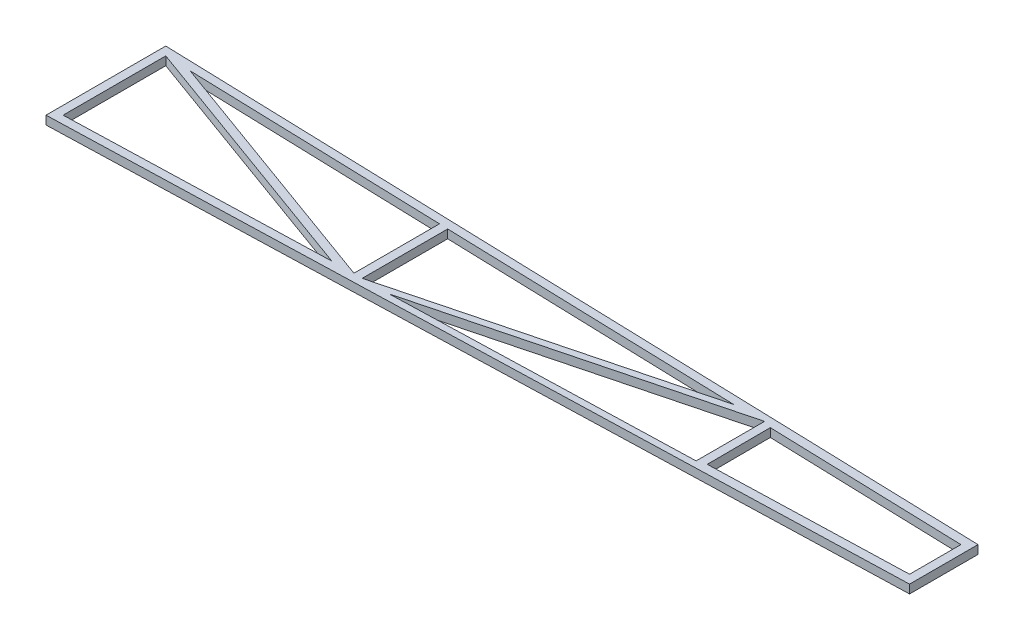
ISO-10303-21;
HEADER;
FILE_DESCRIPTION(('STEP AP214'),'2;1');
FILE_NAME('part.step','',(''),(''),'','','');
FILE_SCHEMA(('AUTOMOTIVE_DESIGN { 1 0 10303 214 1 1 1 1 }'));
ENDSEC;
DATA;
#1=APPLICATION_CONTEXT('core data for automotive mechanical design processes');
#2=APPLICATION_PROTOCOL_DEFINITION('international standard','automotive_design',2000,#1);
#3=PRODUCT_CONTEXT('',#1,'mechanical');
#4=PRODUCT('Part','Part','',(#3));
#5=PRODUCT_RELATED_PRODUCT_CATEGORY('part','',(#4));
#6=PRODUCT_DEFINITION_FORMATION('','',#4);
#7=PRODUCT_DEFINITION_CONTEXT('part definition',#1,'design');
#8=PRODUCT_DEFINITION('design','',#6,#7);
#9=PRODUCT_DEFINITION_SHAPE('','',#8);
#10=(LENGTH_UNIT() NAMED_UNIT(*) SI_UNIT(.MILLI.,.METRE.));
#11=(NAMED_UNIT(*) PLANE_ANGLE_UNIT() SI_UNIT($,.RADIAN.));
#12=(NAMED_UNIT(*) SI_UNIT($,.STERADIAN.) SOLID_ANGLE_UNIT());
#13=UNCERTAINTY_MEASURE_WITH_UNIT(LENGTH_MEASURE(1.E-05),#10,'distance_accuracy_value','');
#14=(GEOMETRIC_REPRESENTATION_CONTEXT(3) GLOBAL_UNCERTAINTY_ASSIGNED_CONTEXT((#13)) GLOBAL_UNIT_ASSIGNED_CONTEXT((#10,
#11,#12)) REPRESENTATION_CONTEXT('',''));
#15=CARTESIAN_POINT('',(0.,0.,0.));
#16=DIRECTION('',(0.,0.,1.));
#17=DIRECTION('',(1.,0.,0.));
#18=AXIS2_PLACEMENT_3D('',#15,#16,#17);
#19=CARTESIAN_POINT('',(0.,-6.35,0.));
#20=DIRECTION('',(0.,-1.,0.));
#21=DIRECTION('',(0.,0.,-1.));
#22=AXIS2_PLACEMENT_3D('',#19,#20,#21);
#23=PLANE('',#22);
#24=DIRECTION('',(0.93999073182008,0.,0.341199976688672));
#25=VECTOR('',#24,1.);
#26=CARTESIAN_POINT('',(-43.9461524009226,-6.35,121.069691612882));
#27=LINE('',#26,#25);
#28=CARTESIAN_POINT('',(-373.2236097595,-6.35,1.5478102031445));
#29=VERTEX_POINT('',#28);
#30=CARTESIAN_POINT('',(-182.217497667349,-6.35,70.879643791595));
#31=VERTEX_POINT('',#30);
#32=EDGE_CURVE('E241',#29,#31,#27,.T.);
#33=ORIENTED_EDGE('',*,*,#32,.T.);
#34=DIRECTION('',(0.,0.,-1.));
#35=VECTOR('',#34,1.);
#36=CARTESIAN_POINT('',(-182.217497667349,-6.35,0.));
#37=LINE('',#36,#35);
#38=CARTESIAN_POINT('',(-182.217497667349,-6.35,7.37964379159507));
#39=VERTEX_POINT('',#38);
#40=EDGE_CURVE('E244',#31,#39,#37,.T.);
#41=ORIENTED_EDGE('',*,*,#40,.T.);
#42=DIRECTION('',(-0.999534218528233,0.,-0.0305179617791833));
#43=VECTOR('',#42,1.);
#44=CARTESIAN_POINT('',(-0.394814323715681,-6.35,12.93108725197));
#45=LINE('',#44,#43);
#46=EDGE_CURVE('E238',#39,#29,#45,.T.);
#47=ORIENTED_EDGE('',*,*,#46,.T.);
#48=EDGE_LOOP('',(#33,#41,#47));
#49=FACE_BOUND('',#48,.T.);
#50=DIRECTION('',(0.,0.,-1.));
#51=VECTOR('',#50,1.);
#52=CARTESIAN_POINT('',(-175.867497667349,-6.35,0.));
#53=LINE('',#52,#51);
#54=CARTESIAN_POINT('',(-175.867497667349,-6.35,71.133643791595));
#55=VERTEX_POINT('',#54);
#56=CARTESIAN_POINT('',(-175.867497667349,-6.35,7.63364379159504));
#57=VERTEX_POINT('',#56);
#58=EDGE_CURVE('E269',#55,#57,#53,.T.);
#59=ORIENTED_EDGE('',*,*,#58,.F.);
#60=DIRECTION('',(-0.967954957195427,0.,0.251123875489366));
#61=VECTOR('',#60,1.);
#62=CARTESIAN_POINT('',(6.20015696238153,-6.35,23.89845511675));
#63=LINE('',#62,#61);
#64=CARTESIAN_POINT('',(43.1053237452034,-6.35,14.323868573037));
#65=VERTEX_POINT('',#64);
#66=EDGE_CURVE('E267',#65,#55,#63,.T.);
#67=ORIENTED_EDGE('',*,*,#66,.F.);
#68=DIRECTION('',(0.999533590836713,0.,0.0305385132098228));
#69=VECTOR('',#68,1.);
#70=CARTESIAN_POINT('',(-0.397025569498829,-6.35,12.9947515914923));
#71=LINE('',#70,#69);
#72=EDGE_CURVE('E265',#57,#65,#71,.T.);
#73=ORIENTED_EDGE('',*,*,#72,.F.);
#74=EDGE_LOOP('',(#59,#67,#73));
#75=FACE_BOUND('',#74,.T.);
#76=DIRECTION('',(0.967972606242531,0.,-0.251055837542252));
#77=VECTOR('',#76,1.);
#78=CARTESIAN_POINT('',(7.46065915213891,-6.35,28.7653685111692));
#79=LINE('',#78,#77);
#80=CARTESIAN_POINT('',(-155.846035454392,-6.35,71.1210082537538));
#81=VERTEX_POINT('',#80);
#82=CARTESIAN_POINT('',(65.4325023326505,-6.35,13.729643791595));
#83=VERTEX_POINT('',#82);
#84=EDGE_CURVE('E294',#81,#83,#79,.T.);
#85=ORIENTED_EDGE('',*,*,#84,.F.);
#86=DIRECTION('',(-0.999556643403006,0.,0.0297744291115209));
#87=VECTOR('',#86,1.);
#88=CARTESIAN_POINT('',(1.97848847025844,-6.35,66.4197888374576));
#89=LINE('',#88,#87);
#90=CARTESIAN_POINT('',(65.4325023326505,-6.35,64.529643791595));
#91=VERTEX_POINT('',#90);
#92=EDGE_CURVE('E292',#91,#81,#89,.T.);
#93=ORIENTED_EDGE('',*,*,#92,.F.);
#94=DIRECTION('',(0.,0.,1.));
#95=VECTOR('',#94,1.);
#96=CARTESIAN_POINT('',(65.4325023326505,-6.35,0.));
#97=LINE('',#96,#95);
#98=EDGE_CURVE('E290',#83,#91,#97,.T.);
#99=ORIENTED_EDGE('',*,*,#98,.F.);
#100=EDGE_LOOP('',(#85,#93,#99));
#101=FACE_BOUND('',#100,.T.);
#102=DIRECTION('',(-0.999531315604909,0.,0.030612891485776));
#103=VECTOR('',#102,1.);
#104=CARTESIAN_POINT('',(-398.117497667349,-6.35,83.579643791595));
#105=LINE('',#104,#103);
#106=CARTESIAN_POINT('',(223.877702332651,-6.35,64.529643791595));
#107=VERTEX_POINT('',#106);
#108=CARTESIAN_POINT('',(-398.117497667349,-6.35,83.579643791595));
#109=VERTEX_POINT('',#108);
#110=EDGE_CURVE('E301',#107,#109,#105,.T.);
#111=ORIENTED_EDGE('',*,*,#110,.T.);
#112=DIRECTION('',(0.,0.,-1.));
#113=VECTOR('',#112,1.);
#114=CARTESIAN_POINT('',(-398.117497667349,-6.35,83.579643791595));
#115=LINE('',#114,#113);
#116=CARTESIAN_POINT('',(-398.117497667349,-6.35,-5.32035620840496));
#117=VERTEX_POINT('',#116);
#118=EDGE_CURVE('E298',#109,#117,#115,.T.);
#119=ORIENTED_EDGE('',*,*,#118,.T.);
#120=DIRECTION('',(0.999531315604909,0.,0.030612891485776));
#121=VECTOR('',#120,1.);
#122=CARTESIAN_POINT('',(-398.117497667349,-6.35,-5.32035620840496));
#123=LINE('',#122,#121);
#124=CARTESIAN_POINT('',(223.877702332651,-6.35,13.729643791595));
#125=VERTEX_POINT('',#124);
#126=EDGE_CURVE('E300',#117,#125,#123,.T.);
#127=ORIENTED_EDGE('',*,*,#126,.T.);
#128=DIRECTION('',(0.,0.,1.));
#129=VECTOR('',#128,1.);
#130=CARTESIAN_POINT('',(223.877702332651,-6.35,64.529643791595));
#131=LINE('',#130,#129);
#132=EDGE_CURVE('E303',#125,#107,#131,.T.);
#133=ORIENTED_EDGE('',*,*,#132,.T.);
#134=EDGE_LOOP('',(#111,#119,#127,#133));
#135=FACE_BOUND('',#134,.T.);
#136=DIRECTION('',(-0.999533590836713,0.,0.0305385132098226));
#137=VECTOR('',#136,1.);
#138=CARTESIAN_POINT('',(1.99201580368187,-6.35,65.1992025799471));
#139=LINE('',#138,#137);
#140=CARTESIAN_POINT('',(-198.182829462049,-6.35,71.3150972456827));
#141=VERTEX_POINT('',#140);
#142=CARTESIAN_POINT('',(-391.767497667349,-6.35,77.229643791595));
#143=VERTEX_POINT('',#142);
#144=EDGE_CURVE('E216',#141,#143,#139,.T.);
#145=ORIENTED_EDGE('',*,*,#144,.F.);
#146=DIRECTION('',(0.939963242887926,0.,0.34127569796224));
#147=VECTOR('',#146,1.);
#148=CARTESIAN_POINT('',(-45.9591045970288,-6.35,126.583490284235));
#149=LINE('',#148,#147);
#150=CARTESIAN_POINT('',(-391.767497667349,-6.35,1.02964379159502));
#151=VERTEX_POINT('',#150);
#152=EDGE_CURVE('E214',#151,#141,#149,.T.);
#153=ORIENTED_EDGE('',*,*,#152,.F.);
#154=DIRECTION('',(0.,0.,-1.));
#155=VECTOR('',#154,1.);
#156=CARTESIAN_POINT('',(-391.767497667349,-6.35,0.));
#157=LINE('',#156,#155);
#158=EDGE_CURVE('E212',#143,#151,#157,.T.);
#159=ORIENTED_EDGE('',*,*,#158,.F.);
#160=EDGE_LOOP('',(#145,#153,#159));
#161=FACE_BOUND('',#160,.T.);
#162=DIRECTION('',(0.999533590836713,0.,-0.0305385132098224));
#163=VECTOR('',#162,1.);
#164=CARTESIAN_POINT('',(1.97875764890678,-6.35,64.765259677778));
#165=LINE('',#164,#163);
#166=CARTESIAN_POINT('',(71.7825023326505,-6.35,62.6325623891005));
#167=VERTEX_POINT('',#166);
#168=CARTESIAN_POINT('',(217.527702332651,-6.35,58.179643791595));
#169=VERTEX_POINT('',#168);
#170=EDGE_CURVE('E192',#167,#169,#165,.T.);
#171=ORIENTED_EDGE('',*,*,#170,.T.);
#172=DIRECTION('',(0.,0.,-1.));
#173=VECTOR('',#172,1.);
#174=CARTESIAN_POINT('',(217.527702332651,-6.35,0.));
#175=LINE('',#174,#173);
#176=CARTESIAN_POINT('',(217.527702332651,-6.35,20.079643791595));
#177=VERTEX_POINT('',#176);
#178=EDGE_CURVE('E156',#169,#177,#175,.T.);
#179=ORIENTED_EDGE('',*,*,#178,.T.);
#180=DIRECTION('',(-0.999533590836713,0.,-0.0305385132098227));
#181=VECTOR('',#180,1.);
#182=CARTESIAN_POINT('',(-0.410049957089261,-6.35,13.4210432320601));
#183=LINE('',#182,#181);
#184=CARTESIAN_POINT('',(71.594601163736,-6.35,15.6209842941522));
#185=VERTEX_POINT('',#184);
#186=EDGE_CURVE('E159',#177,#185,#183,.T.);
#187=ORIENTED_EDGE('',*,*,#186,.T.);
#188=DIRECTION('',(0.00399688067614495,0.,0.99999201244053));
#189=VECTOR('',#188,1.);
#190=CARTESIAN_POINT('',(71.531022724472,-6.35,-0.285903246141509));
#191=LINE('',#190,#189);
#192=EDGE_CURVE('E189',#185,#167,#191,.T.);
#193=ORIENTED_EDGE('',*,*,#192,.T.);
#194=EDGE_LOOP('',(#171,#179,#187,#193));
#195=FACE_BOUND('',#194,.T.);
#196=ADVANCED_FACE('F16',(#49,#75,#101,#135,#161,#195),#23,.T.);
#197=CARTESIAN_POINT('',(0.,0.,0.));
#198=DIRECTION('',(0.,-1.,0.));
#199=DIRECTION('',(0.,0.,-1.));
#200=AXIS2_PLACEMENT_3D('',#197,#198,#199);
#201=PLANE('',#200);
#202=DIRECTION('',(0.,0.,1.));
#203=VECTOR('',#202,1.);
#204=CARTESIAN_POINT('',(-182.217497667349,0.,70.879643791595));
#205=LINE('',#204,#203);
#206=CARTESIAN_POINT('',(-182.217497667349,0.,7.37964379159507));
#207=VERTEX_POINT('',#206);
#208=CARTESIAN_POINT('',(-182.217497667349,0.,70.879643791595));
#209=VERTEX_POINT('',#208);
#210=EDGE_CURVE('E219',#207,#209,#205,.T.);
#211=ORIENTED_EDGE('',*,*,#210,.T.);
#212=DIRECTION('',(-0.93999073182008,0.,-0.341199976688672));
#213=VECTOR('',#212,1.);
#214=CARTESIAN_POINT('',(-182.217497667349,0.,70.879643791595));
#215=LINE('',#214,#213);
#216=CARTESIAN_POINT('',(-373.2236097595,0.,1.5478102031445));
#217=VERTEX_POINT('',#216);
#218=EDGE_CURVE('E220',#209,#217,#215,.T.);
#219=ORIENTED_EDGE('',*,*,#218,.T.);
#220=DIRECTION('',(0.999534218528232,0.,0.0305179617791833));
#221=VECTOR('',#220,1.);
#222=CARTESIAN_POINT('',(-373.2236097595,0.,1.5478102031445));
#223=LINE('',#222,#221);
#224=EDGE_CURVE('E224',#217,#207,#223,.T.);
#225=ORIENTED_EDGE('',*,*,#224,.T.);
#226=EDGE_LOOP('',(#211,#219,#225));
#227=FACE_BOUND('',#226,.T.);
#228=DIRECTION('',(0.967954957195427,0.,-0.251123875489366));
#229=VECTOR('',#228,1.);
#230=CARTESIAN_POINT('',(-175.867497667349,0.,71.133643791595));
#231=LINE('',#230,#229);
#232=CARTESIAN_POINT('',(-175.867497667349,0.,71.133643791595));
#233=VERTEX_POINT('',#232);
#234=CARTESIAN_POINT('',(43.1053237452034,0.,14.323868573037));
#235=VERTEX_POINT('',#234);
#236=EDGE_CURVE('E248',#233,#235,#231,.T.);
#237=ORIENTED_EDGE('',*,*,#236,.F.);
#238=DIRECTION('',(0.,0.,1.));
#239=VECTOR('',#238,1.);
#240=CARTESIAN_POINT('',(-175.867497667349,0.,71.133643791595));
#241=LINE('',#240,#239);
#242=CARTESIAN_POINT('',(-175.867497667349,0.,7.63364379159504));
#243=VERTEX_POINT('',#242);
#244=EDGE_CURVE('E247',#243,#233,#241,.T.);
#245=ORIENTED_EDGE('',*,*,#244,.F.);
#246=DIRECTION('',(-0.999533590836713,0.,-0.0305385132098228));
#247=VECTOR('',#246,1.);
#248=CARTESIAN_POINT('',(-175.867497667349,0.,7.63364379159504));
#249=LINE('',#248,#247);
#250=EDGE_CURVE('E251',#235,#243,#249,.T.);
#251=ORIENTED_EDGE('',*,*,#250,.F.);
#252=EDGE_LOOP('',(#237,#245,#251));
#253=FACE_BOUND('',#252,.T.);
#254=DIRECTION('',(0.999556643403006,0.,-0.0297744291115209));
#255=VECTOR('',#254,1.);
#256=CARTESIAN_POINT('',(-155.846035454392,0.,71.1210082537538));
#257=LINE('',#256,#255);
#258=CARTESIAN_POINT('',(-155.846035454392,0.,71.1210082537538));
#259=VERTEX_POINT('',#258);
#260=CARTESIAN_POINT('',(65.4325023326505,0.,64.529643791595));
#261=VERTEX_POINT('',#260);
#262=EDGE_CURVE('E273',#259,#261,#257,.T.);
#263=ORIENTED_EDGE('',*,*,#262,.F.);
#264=DIRECTION('',(-0.967972606242531,0.,0.251055837542252));
#265=VECTOR('',#264,1.);
#266=CARTESIAN_POINT('',(65.4325023326505,0.,13.729643791595));
#267=LINE('',#266,#265);
#268=CARTESIAN_POINT('',(65.4325023326505,0.,13.729643791595));
#269=VERTEX_POINT('',#268);
#270=EDGE_CURVE('E272',#269,#259,#267,.T.);
#271=ORIENTED_EDGE('',*,*,#270,.F.);
#272=DIRECTION('',(0.,0.,-1.));
#273=VECTOR('',#272,1.);
#274=CARTESIAN_POINT('',(65.4325023326505,0.,64.529643791595));
#275=LINE('',#274,#273);
#276=EDGE_CURVE('E276',#261,#269,#275,.T.);
#277=ORIENTED_EDGE('',*,*,#276,.F.);
#278=EDGE_LOOP('',(#263,#271,#277));
#279=FACE_BOUND('',#278,.T.);
#280=DIRECTION('',(-0.999531315604909,0.,0.030612891485776));
#281=VECTOR('',#280,1.);
#282=CARTESIAN_POINT('',(-398.117497667349,0.,83.579643791595));
#283=LINE('',#282,#281);
#284=CARTESIAN_POINT('',(223.877702332651,0.,64.529643791595));
#285=VERTEX_POINT('',#284);
#286=CARTESIAN_POINT('',(-398.117497667349,0.,83.579643791595));
#287=VERTEX_POINT('',#286);
#288=EDGE_CURVE('E297',#285,#287,#283,.T.);
#289=ORIENTED_EDGE('',*,*,#288,.F.);
#290=DIRECTION('',(0.,0.,1.));
#291=VECTOR('',#290,1.);
#292=CARTESIAN_POINT('',(223.877702332651,0.,64.529643791595));
#293=LINE('',#292,#291);
#294=CARTESIAN_POINT('',(223.877702332651,0.,13.729643791595));
#295=VERTEX_POINT('',#294);
#296=EDGE_CURVE('E308',#295,#285,#293,.T.);
#297=ORIENTED_EDGE('',*,*,#296,.F.);
#298=DIRECTION('',(0.999531315604909,0.,0.030612891485776));
#299=VECTOR('',#298,1.);
#300=CARTESIAN_POINT('',(-398.117497667349,0.,-5.32035620840496));
#301=LINE('',#300,#299);
#302=CARTESIAN_POINT('',(-398.117497667349,0.,-5.32035620840496));
#303=VERTEX_POINT('',#302);
#304=EDGE_CURVE('E312',#303,#295,#301,.T.);
#305=ORIENTED_EDGE('',*,*,#304,.F.);
#306=DIRECTION('',(0.,0.,-1.));
#307=VECTOR('',#306,1.);
#308=CARTESIAN_POINT('',(-398.117497667349,0.,83.579643791595));
#309=LINE('',#308,#307);
#310=EDGE_CURVE('E309',#287,#303,#309,.T.);
#311=ORIENTED_EDGE('',*,*,#310,.F.);
#312=EDGE_LOOP('',(#289,#297,#305,#311));
#313=FACE_BOUND('',#312,.T.);
#314=DIRECTION('',(-0.939963242887926,0.,-0.34127569796224));
#315=VECTOR('',#314,1.);
#316=CARTESIAN_POINT('',(-198.182829462049,0.,71.3150972456827));
#317=LINE('',#316,#315);
#318=CARTESIAN_POINT('',(-198.182829462049,0.,71.3150972456827));
#319=VERTEX_POINT('',#318);
#320=CARTESIAN_POINT('',(-391.767497667349,0.,1.02964379159502));
#321=VERTEX_POINT('',#320);
#322=EDGE_CURVE('E196',#319,#321,#317,.T.);
#323=ORIENTED_EDGE('',*,*,#322,.F.);
#324=DIRECTION('',(0.999533590836713,0.,-0.0305385132098226));
#325=VECTOR('',#324,1.);
#326=CARTESIAN_POINT('',(-391.767497667349,0.,77.229643791595));
#327=LINE('',#326,#325);
#328=CARTESIAN_POINT('',(-391.767497667349,0.,77.229643791595));
#329=VERTEX_POINT('',#328);
#330=EDGE_CURVE('E195',#329,#319,#327,.T.);
#331=ORIENTED_EDGE('',*,*,#330,.F.);
#332=DIRECTION('',(0.,0.,1.));
#333=VECTOR('',#332,1.);
#334=CARTESIAN_POINT('',(-391.767497667349,0.,77.229643791595));
#335=LINE('',#334,#333);
#336=EDGE_CURVE('E199',#321,#329,#335,.T.);
#337=ORIENTED_EDGE('',*,*,#336,.F.);
#338=EDGE_LOOP('',(#323,#331,#337));
#339=FACE_BOUND('',#338,.T.);
#340=DIRECTION('',(0.,0.,1.));
#341=VECTOR('',#340,1.);
#342=CARTESIAN_POINT('',(217.527702332651,0.,58.179643791595));
#343=LINE('',#342,#341);
#344=CARTESIAN_POINT('',(217.527702332651,0.,20.079643791595));
#345=VERTEX_POINT('',#344);
#346=CARTESIAN_POINT('',(217.527702332651,0.,58.179643791595));
#347=VERTEX_POINT('',#346);
#348=EDGE_CURVE('E39',#345,#347,#343,.T.);
#349=ORIENTED_EDGE('',*,*,#348,.T.);
#350=DIRECTION('',(-0.999533590836713,0.,0.0305385132098224));
#351=VECTOR('',#350,1.);
#352=CARTESIAN_POINT('',(217.527702332651,0.,58.179643791595));
#353=LINE('',#352,#351);
#354=CARTESIAN_POINT('',(71.7825023326505,0.,62.6325623891005));
#355=VERTEX_POINT('',#354);
#356=EDGE_CURVE('E163',#347,#355,#353,.T.);
#357=ORIENTED_EDGE('',*,*,#356,.T.);
#358=DIRECTION('',(-0.00399688067614495,0.,-0.99999201244053));
#359=VECTOR('',#358,1.);
#360=CARTESIAN_POINT('',(71.7825023326505,0.,62.6325623891005));
#361=LINE('',#360,#359);
#362=CARTESIAN_POINT('',(71.594601163736,0.,15.6209842941522));
#363=VERTEX_POINT('',#362);
#364=EDGE_CURVE('E170',#355,#363,#361,.T.);
#365=ORIENTED_EDGE('',*,*,#364,.T.);
#366=DIRECTION('',(0.999533590836713,0.,0.0305385132098227));
#367=VECTOR('',#366,1.);
#368=CARTESIAN_POINT('',(217.527702332651,0.,20.079643791595));
#369=LINE('',#368,#367);
#370=EDGE_CURVE('E174',#363,#345,#369,.T.);
#371=ORIENTED_EDGE('',*,*,#370,.T.);
#372=EDGE_LOOP('',(#349,#357,#365,#371));
#373=FACE_BOUND('',#372,.T.);
#374=ADVANCED_FACE('F173',(#227,#253,#279,#313,#339,#373),#201,.F.);
#375=CARTESIAN_POINT('',(-398.117497667349,-6.35,83.579643791595));
#376=DIRECTION('',(-0.030612891485776,0.,-0.999531315604909));
#377=DIRECTION('',(-0.999531315604909,0.,0.030612891485776));
#378=AXIS2_PLACEMENT_3D('',#375,#376,#377);
#379=PLANE('',#378);
#380=ORIENTED_EDGE('',*,*,#288,.T.);
#381=DIRECTION('',(0.,1.,0.));
#382=VECTOR('',#381,1.);
#383=CARTESIAN_POINT('',(-398.117497667349,-6.35,83.579643791595));
#384=LINE('',#383,#382);
#385=EDGE_CURVE('E10',#109,#287,#384,.T.);
#386=ORIENTED_EDGE('',*,*,#385,.F.);
#387=ORIENTED_EDGE('',*,*,#110,.F.);
#388=DIRECTION('',(0.,1.,0.));
#389=VECTOR('',#388,1.);
#390=CARTESIAN_POINT('',(223.877702332651,-6.35,64.529643791595));
#391=LINE('',#390,#389);
#392=EDGE_CURVE('E305',#107,#285,#391,.T.);
#393=ORIENTED_EDGE('',*,*,#392,.T.);
#394=EDGE_LOOP('',(#380,#386,#387,#393));
#395=FACE_BOUND('',#394,.T.);
#396=ADVANCED_FACE('F18',(#395),#379,.F.);
#397=CARTESIAN_POINT('',(-398.117497667349,-6.35,83.579643791595));
#398=DIRECTION('',(1.,0.,0.));
#399=DIRECTION('',(0.,0.,-1.));
#400=AXIS2_PLACEMENT_3D('',#397,#398,#399);
#401=PLANE('',#400);
#402=ORIENTED_EDGE('',*,*,#310,.T.);
#403=DIRECTION('',(0.,1.,0.));
#404=VECTOR('',#403,1.);
#405=CARTESIAN_POINT('',(-398.117497667349,-6.35,-5.32035620840496));
#406=LINE('',#405,#404);
#407=EDGE_CURVE('E24',#117,#303,#406,.T.);
#408=ORIENTED_EDGE('',*,*,#407,.F.);
#409=ORIENTED_EDGE('',*,*,#118,.F.);
#410=ORIENTED_EDGE('',*,*,#385,.T.);
#411=EDGE_LOOP('',(#402,#408,#409,#410));
#412=FACE_BOUND('',#411,.T.);
#413=ADVANCED_FACE('F345',(#412),#401,.F.);
#414=CARTESIAN_POINT('',(-398.117497667349,-6.35,-5.32035620840496));
#415=DIRECTION('',(-0.030612891485776,0.,0.999531315604909));
#416=DIRECTION('',(0.999531315604909,0.,0.030612891485776));
#417=AXIS2_PLACEMENT_3D('',#414,#415,#416);
#418=PLANE('',#417);
#419=ORIENTED_EDGE('',*,*,#304,.T.);
#420=DIRECTION('',(0.,1.,0.));
#421=VECTOR('',#420,1.);
#422=CARTESIAN_POINT('',(223.877702332651,-6.35,13.729643791595));
#423=LINE('',#422,#421);
#424=EDGE_CURVE('E322',#125,#295,#423,.T.);
#425=ORIENTED_EDGE('',*,*,#424,.F.);
#426=ORIENTED_EDGE('',*,*,#126,.F.);
#427=ORIENTED_EDGE('',*,*,#407,.T.);
#428=EDGE_LOOP('',(#419,#425,#426,#427));
#429=FACE_BOUND('',#428,.T.);
#430=ADVANCED_FACE('F329',(#429),#418,.F.);
#431=CARTESIAN_POINT('',(223.877702332651,-6.35,64.529643791595));
#432=DIRECTION('',(-1.,0.,0.));
#433=DIRECTION('',(0.,0.,1.));
#434=AXIS2_PLACEMENT_3D('',#431,#432,#433);
#435=PLANE('',#434);
#436=ORIENTED_EDGE('',*,*,#296,.T.);
#437=ORIENTED_EDGE('',*,*,#392,.F.);
#438=ORIENTED_EDGE('',*,*,#132,.F.);
#439=ORIENTED_EDGE('',*,*,#424,.T.);
#440=EDGE_LOOP('',(#436,#437,#438,#439));
#441=FACE_BOUND('',#440,.T.);
#442=ADVANCED_FACE('F338',(#441),#435,.F.);
#443=CARTESIAN_POINT('',(65.4325023326505,-24.7181924473085,13.729643791595));
#444=DIRECTION('',(-0.251055837542252,0.,-0.967972606242531));
#445=DIRECTION('',(-0.967972606242531,0.,0.251055837542252));
#446=AXIS2_PLACEMENT_3D('',#443,#444,#445);
#447=PLANE('',#446);
#448=ORIENTED_EDGE('',*,*,#84,.T.);
#449=DIRECTION('',(0.,1.,0.));
#450=VECTOR('',#449,1.);
#451=CARTESIAN_POINT('',(65.4325023326505,-24.7181924473085,13.729643791595));
#452=LINE('',#451,#450);
#453=EDGE_CURVE('E280',#83,#269,#452,.T.);
#454=ORIENTED_EDGE('',*,*,#453,.T.);
#455=ORIENTED_EDGE('',*,*,#270,.T.);
#456=DIRECTION('',(0.,1.,0.));
#457=VECTOR('',#456,1.);
#458=CARTESIAN_POINT('',(-155.846035454392,-24.7181924473085,71.1210082537538));
#459=LINE('',#458,#457);
#460=EDGE_CURVE('E288',#81,#259,#459,.T.);
#461=ORIENTED_EDGE('',*,*,#460,.F.);
#462=EDGE_LOOP('',(#448,#454,#455,#461));
#463=FACE_BOUND('',#462,.T.);
#464=ADVANCED_FACE('F363',(#463),#447,.F.);
#465=CARTESIAN_POINT('',(-155.846035454392,-24.7181924473085,71.1210082537538));
#466=DIRECTION('',(0.0297744291115209,0.,0.999556643403005));
#467=DIRECTION('',(0.999556643403006,0.,-0.0297744291115209));
#468=AXIS2_PLACEMENT_3D('',#465,#466,#467);
#469=PLANE('',#468);
#470=ORIENTED_EDGE('',*,*,#92,.T.);
#471=ORIENTED_EDGE('',*,*,#460,.T.);
#472=ORIENTED_EDGE('',*,*,#262,.T.);
#473=DIRECTION('',(0.,1.,0.));
#474=VECTOR('',#473,1.);
#475=CARTESIAN_POINT('',(65.4325023326505,-24.7181924473085,64.529643791595));
#476=LINE('',#475,#474);
#477=EDGE_CURVE('E285',#91,#261,#476,.T.);
#478=ORIENTED_EDGE('',*,*,#477,.F.);
#479=EDGE_LOOP('',(#470,#471,#472,#478));
#480=FACE_BOUND('',#479,.T.);
#481=ADVANCED_FACE('F370',(#480),#469,.F.);
#482=CARTESIAN_POINT('',(65.4325023326505,-24.7181924473085,64.529643791595));
#483=DIRECTION('',(1.,0.,0.));
#484=DIRECTION('',(0.,0.,-1.));
#485=AXIS2_PLACEMENT_3D('',#482,#483,#484);
#486=PLANE('',#485);
#487=ORIENTED_EDGE('',*,*,#98,.T.);
#488=ORIENTED_EDGE('',*,*,#477,.T.);
#489=ORIENTED_EDGE('',*,*,#276,.T.);
#490=ORIENTED_EDGE('',*,*,#453,.F.);
#491=EDGE_LOOP('',(#487,#488,#489,#490));
#492=FACE_BOUND('',#491,.T.);
#493=ADVANCED_FACE('F375',(#492),#486,.F.);
#494=CARTESIAN_POINT('',(-175.867497667349,-24.7181924473085,71.133643791595));
#495=DIRECTION('',(-1.,0.,0.));
#496=DIRECTION('',(0.,0.,1.));
#497=AXIS2_PLACEMENT_3D('',#494,#495,#496);
#498=PLANE('',#497);
#499=ORIENTED_EDGE('',*,*,#58,.T.);
#500=DIRECTION('',(0.,1.,0.));
#501=VECTOR('',#500,1.);
#502=CARTESIAN_POINT('',(-175.867497667349,-24.7181924473085,7.63364379159504));
#503=LINE('',#502,#501);
#504=EDGE_CURVE('E255',#57,#243,#503,.T.);
#505=ORIENTED_EDGE('',*,*,#504,.T.);
#506=ORIENTED_EDGE('',*,*,#244,.T.);
#507=DIRECTION('',(0.,1.,0.));
#508=VECTOR('',#507,1.);
#509=CARTESIAN_POINT('',(-175.867497667349,-24.7181924473085,71.133643791595));
#510=LINE('',#509,#508);
#511=EDGE_CURVE('E263',#55,#233,#510,.T.);
#512=ORIENTED_EDGE('',*,*,#511,.F.);
#513=EDGE_LOOP('',(#499,#505,#506,#512));
#514=FACE_BOUND('',#513,.T.);
#515=ADVANCED_FACE('F389',(#514),#498,.F.);
#516=CARTESIAN_POINT('',(-175.867497667349,-24.7181924473085,71.133643791595));
#517=DIRECTION('',(0.251123875489366,0.,0.967954957195427));
#518=DIRECTION('',(0.967954957195427,0.,-0.251123875489366));
#519=AXIS2_PLACEMENT_3D('',#516,#517,#518);
#520=PLANE('',#519);
#521=ORIENTED_EDGE('',*,*,#66,.T.);
#522=ORIENTED_EDGE('',*,*,#511,.T.);
#523=ORIENTED_EDGE('',*,*,#236,.T.);
#524=DIRECTION('',(0.,1.,0.));
#525=VECTOR('',#524,1.);
#526=CARTESIAN_POINT('',(43.1053237452034,-24.7181924473085,14.323868573037));
#527=LINE('',#526,#525);
#528=EDGE_CURVE('E260',#65,#235,#527,.T.);
#529=ORIENTED_EDGE('',*,*,#528,.F.);
#530=EDGE_LOOP('',(#521,#522,#523,#529));
#531=FACE_BOUND('',#530,.T.);
#532=ADVANCED_FACE('F394',(#531),#520,.F.);
#533=CARTESIAN_POINT('',(-175.867497667349,-24.7181924473085,7.63364379159504));
#534=DIRECTION('',(0.0305385132098228,0.,-0.999533590836713));
#535=DIRECTION('',(-0.999533590836713,0.,-0.0305385132098228));
#536=AXIS2_PLACEMENT_3D('',#533,#534,#535);
#537=PLANE('',#536);
#538=ORIENTED_EDGE('',*,*,#72,.T.);
#539=ORIENTED_EDGE('',*,*,#528,.T.);
#540=ORIENTED_EDGE('',*,*,#250,.T.);
#541=ORIENTED_EDGE('',*,*,#504,.F.);
#542=EDGE_LOOP('',(#538,#539,#540,#541));
#543=FACE_BOUND('',#542,.T.);
#544=ADVANCED_FACE('F400',(#543),#537,.F.);
#545=CARTESIAN_POINT('',(-182.217497667349,-25.1498504279651,70.879643791595));
#546=DIRECTION('',(-1.,0.,0.));
#547=DIRECTION('',(0.,0.,1.));
#548=AXIS2_PLACEMENT_3D('',#545,#546,#547);
#549=PLANE('',#548);
#550=DIRECTION('',(0.,1.,0.));
#551=VECTOR('',#550,1.);
#552=CARTESIAN_POINT('',(-182.217497667349,-25.1498504279651,70.879643791595));
#553=LINE('',#552,#551);
#554=EDGE_CURVE('E236',#31,#209,#553,.T.);
#555=ORIENTED_EDGE('',*,*,#554,.T.);
#556=ORIENTED_EDGE('',*,*,#210,.F.);
#557=DIRECTION('',(0.,1.,0.));
#558=VECTOR('',#557,1.);
#559=CARTESIAN_POINT('',(-182.217497667349,-25.1498504279651,7.37964379159507));
#560=LINE('',#559,#558);
#561=EDGE_CURVE('E228',#39,#207,#560,.T.);
#562=ORIENTED_EDGE('',*,*,#561,.F.);
#563=ORIENTED_EDGE('',*,*,#40,.F.);
#564=EDGE_LOOP('',(#555,#556,#562,#563));
#565=FACE_BOUND('',#564,.T.);
#566=ADVANCED_FACE('F404',(#565),#549,.T.);
#567=CARTESIAN_POINT('',(-182.217497667349,-25.1498504279651,70.879643791595));
#568=DIRECTION('',(0.341199976688672,0.,-0.93999073182008));
#569=DIRECTION('',(-0.93999073182008,0.,-0.341199976688672));
#570=AXIS2_PLACEMENT_3D('',#567,#568,#569);
#571=PLANE('',#570);
#572=DIRECTION('',(0.,1.,0.));
#573=VECTOR('',#572,1.);
#574=CARTESIAN_POINT('',(-373.2236097595,-25.1498504279651,1.5478102031445));
#575=LINE('',#574,#573);
#576=EDGE_CURVE('E234',#29,#217,#575,.T.);
#577=ORIENTED_EDGE('',*,*,#576,.T.);
#578=ORIENTED_EDGE('',*,*,#218,.F.);
#579=ORIENTED_EDGE('',*,*,#554,.F.);
#580=ORIENTED_EDGE('',*,*,#32,.F.);
#581=EDGE_LOOP('',(#577,#578,#579,#580));
#582=FACE_BOUND('',#581,.T.);
#583=ADVANCED_FACE('F408',(#582),#571,.T.);
#584=CARTESIAN_POINT('',(-373.2236097595,-25.1498504279651,1.5478102031445));
#585=DIRECTION('',(-0.0305179617791833,0.,0.999534218528232));
#586=DIRECTION('',(0.999534218528233,0.,0.0305179617791833));
#587=AXIS2_PLACEMENT_3D('',#584,#585,#586);
#588=PLANE('',#587);
#589=ORIENTED_EDGE('',*,*,#561,.T.);
#590=ORIENTED_EDGE('',*,*,#224,.F.);
#591=ORIENTED_EDGE('',*,*,#576,.F.);
#592=ORIENTED_EDGE('',*,*,#46,.F.);
#593=EDGE_LOOP('',(#589,#590,#591,#592));
#594=FACE_BOUND('',#593,.T.);
#595=ADVANCED_FACE('F412',(#594),#588,.T.);
#596=CARTESIAN_POINT('',(-391.767497667349,-25.1498504279651,77.229643791595));
#597=DIRECTION('',(0.0305385132098226,0.,0.999533590836713));
#598=DIRECTION('',(0.999533590836713,0.,-0.0305385132098226));
#599=AXIS2_PLACEMENT_3D('',#596,#597,#598);
#600=PLANE('',#599);
#601=ORIENTED_EDGE('',*,*,#144,.T.);
#602=DIRECTION('',(0.,1.,0.));
#603=VECTOR('',#602,1.);
#604=CARTESIAN_POINT('',(-391.767497667349,-25.1498504279651,77.229643791595));
#605=LINE('',#604,#603);
#606=EDGE_CURVE('E202',#143,#329,#605,.T.);
#607=ORIENTED_EDGE('',*,*,#606,.T.);
#608=ORIENTED_EDGE('',*,*,#330,.T.);
#609=DIRECTION('',(0.,1.,0.));
#610=VECTOR('',#609,1.);
#611=CARTESIAN_POINT('',(-198.182829462049,-25.1498504279651,71.3150972456827));
#612=LINE('',#611,#610);
#613=EDGE_CURVE('E210',#141,#319,#612,.T.);
#614=ORIENTED_EDGE('',*,*,#613,.F.);
#615=EDGE_LOOP('',(#601,#607,#608,#614));
#616=FACE_BOUND('',#615,.T.);
#617=ADVANCED_FACE('F416',(#616),#600,.F.);
#618=CARTESIAN_POINT('',(-198.182829462049,-25.1498504279651,71.3150972456827));
#619=DIRECTION('',(0.34127569796224,0.,-0.939963242887926));
#620=DIRECTION('',(-0.939963242887926,0.,-0.34127569796224));
#621=AXIS2_PLACEMENT_3D('',#618,#619,#620);
#622=PLANE('',#621);
#623=ORIENTED_EDGE('',*,*,#152,.T.);
#624=ORIENTED_EDGE('',*,*,#613,.T.);
#625=ORIENTED_EDGE('',*,*,#322,.T.);
#626=DIRECTION('',(0.,1.,0.));
#627=VECTOR('',#626,1.);
#628=CARTESIAN_POINT('',(-391.767497667349,-25.1498504279651,1.02964379159502));
#629=LINE('',#628,#627);
#630=EDGE_CURVE('E207',#151,#321,#629,.T.);
#631=ORIENTED_EDGE('',*,*,#630,.F.);
#632=EDGE_LOOP('',(#623,#624,#625,#631));
#633=FACE_BOUND('',#632,.T.);
#634=ADVANCED_FACE('F420',(#633),#622,.F.);
#635=CARTESIAN_POINT('',(-391.767497667349,-25.1498504279651,77.229643791595));
#636=DIRECTION('',(-1.,0.,0.));
#637=DIRECTION('',(0.,0.,1.));
#638=AXIS2_PLACEMENT_3D('',#635,#636,#637);
#639=PLANE('',#638);
#640=ORIENTED_EDGE('',*,*,#158,.T.);
#641=ORIENTED_EDGE('',*,*,#630,.T.);
#642=ORIENTED_EDGE('',*,*,#336,.T.);
#643=ORIENTED_EDGE('',*,*,#606,.F.);
#644=EDGE_LOOP('',(#640,#641,#642,#643));
#645=FACE_BOUND('',#644,.T.);
#646=ADVANCED_FACE('F424',(#645),#639,.F.);
#647=CARTESIAN_POINT('',(217.527702332651,-26.8621682683992,58.179643791595));
#648=DIRECTION('',(-1.,0.,0.));
#649=DIRECTION('',(0.,0.,1.));
#650=AXIS2_PLACEMENT_3D('',#647,#648,#649);
#651=PLANE('',#650);
#652=DIRECTION('',(0.,1.,0.));
#653=VECTOR('',#652,1.);
#654=CARTESIAN_POINT('',(217.527702332651,-26.8621682683992,58.179643791595));
#655=LINE('',#654,#653);
#656=EDGE_CURVE('E152',#169,#347,#655,.T.);
#657=ORIENTED_EDGE('',*,*,#656,.T.);
#658=ORIENTED_EDGE('',*,*,#348,.F.);
#659=DIRECTION('',(0.,1.,0.));
#660=VECTOR('',#659,1.);
#661=CARTESIAN_POINT('',(217.527702332651,-26.8621682683992,20.079643791595));
#662=LINE('',#661,#660);
#663=EDGE_CURVE('E183',#177,#345,#662,.T.);
#664=ORIENTED_EDGE('',*,*,#663,.F.);
#665=ORIENTED_EDGE('',*,*,#178,.F.);
#666=EDGE_LOOP('',(#657,#658,#664,#665));
#667=FACE_BOUND('',#666,.T.);
#668=ADVANCED_FACE('F154',(#667),#651,.T.);
#669=CARTESIAN_POINT('',(217.527702332651,-26.8621682683992,58.179643791595));
#670=DIRECTION('',(-0.0305385132098224,0.,-0.999533590836713));
#671=DIRECTION('',(-0.999533590836713,0.,0.0305385132098224));
#672=AXIS2_PLACEMENT_3D('',#669,#670,#671);
#673=PLANE('',#672);
#674=DIRECTION('',(0.,1.,0.));
#675=VECTOR('',#674,1.);
#676=CARTESIAN_POINT('',(71.7825023326505,-26.8621682683992,62.6325623891005));
#677=LINE('',#676,#675);
#678=EDGE_CURVE('E160',#167,#355,#677,.T.);
#679=ORIENTED_EDGE('',*,*,#678,.T.);
#680=ORIENTED_EDGE('',*,*,#356,.F.);
#681=ORIENTED_EDGE('',*,*,#656,.F.);
#682=ORIENTED_EDGE('',*,*,#170,.F.);
#683=EDGE_LOOP('',(#679,#680,#681,#682));
#684=FACE_BOUND('',#683,.T.);
#685=ADVANCED_FACE('F164',(#684),#673,.T.);
#686=CARTESIAN_POINT('',(71.7825023326505,-26.8621682683992,62.6325623891005));
#687=DIRECTION('',(0.99999201244053,0.,-0.00399688067614495));
#688=DIRECTION('',(-0.00399688067614495,0.,-0.99999201244053));
#689=AXIS2_PLACEMENT_3D('',#686,#687,#688);
#690=PLANE('',#689);
#691=DIRECTION('',(0.,1.,0.));
#692=VECTOR('',#691,1.);
#693=CARTESIAN_POINT('',(71.594601163736,-26.8621682683992,15.6209842941522));
#694=LINE('',#693,#692);
#695=EDGE_CURVE('E31',#185,#363,#694,.T.);
#696=ORIENTED_EDGE('',*,*,#695,.T.);
#697=ORIENTED_EDGE('',*,*,#364,.F.);
#698=ORIENTED_EDGE('',*,*,#678,.F.);
#699=ORIENTED_EDGE('',*,*,#192,.F.);
#700=EDGE_LOOP('',(#696,#697,#698,#699));
#701=FACE_BOUND('',#700,.T.);
#702=ADVANCED_FACE('F433',(#701),#690,.T.);
#703=CARTESIAN_POINT('',(217.527702332651,-26.8621682683992,20.079643791595));
#704=DIRECTION('',(-0.0305385132098227,0.,0.999533590836713));
#705=DIRECTION('',(0.999533590836713,0.,0.0305385132098227));
#706=AXIS2_PLACEMENT_3D('',#703,#704,#705);
#707=PLANE('',#706);
#708=ORIENTED_EDGE('',*,*,#663,.T.);
#709=ORIENTED_EDGE('',*,*,#370,.F.);
#710=ORIENTED_EDGE('',*,*,#695,.F.);
#711=ORIENTED_EDGE('',*,*,#186,.F.);
#712=EDGE_LOOP('',(#708,#709,#710,#711));
#713=FACE_BOUND('',#712,.T.);
#714=ADVANCED_FACE('F436',(#713),#707,.T.);
#715=CLOSED_SHELL('',(#196,#374,#396,#413,#430,#442,#464,#481,#493,#515,#532,#544,#566,#583,
#595,#617,#634,#646,#668,#685,#702,#714));
#716=MANIFOLD_SOLID_BREP('B1',#715);
#717=ADVANCED_BREP_SHAPE_REPRESENTATION('',(#18,#716),#14);
#718=SHAPE_DEFINITION_REPRESENTATION(#9,#717);
ENDSEC;
END-ISO-10303-21;
